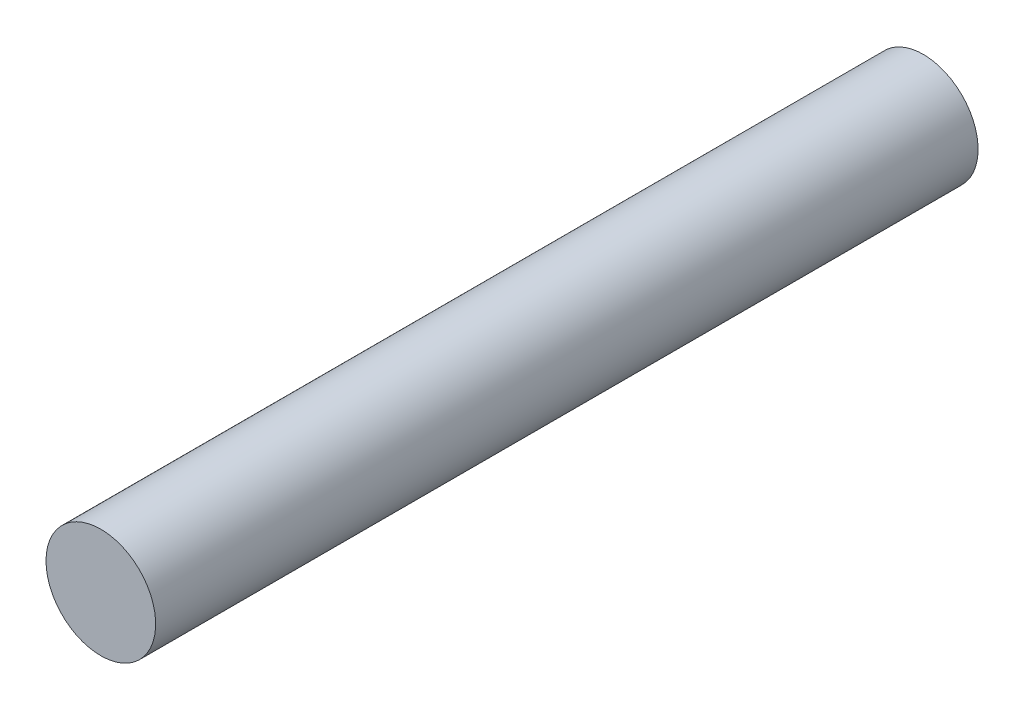
ISO-10303-21;
HEADER;
FILE_DESCRIPTION(('STEP AP214'),'2;1');
FILE_NAME('part.step','',(''),(''),'','','');
FILE_SCHEMA(('AUTOMOTIVE_DESIGN { 1 0 10303 214 1 1 1 1 }'));
ENDSEC;
DATA;
#1=APPLICATION_CONTEXT('core data for automotive mechanical design processes');
#2=APPLICATION_PROTOCOL_DEFINITION('international standard','automotive_design',2000,#1);
#3=PRODUCT_CONTEXT('',#1,'mechanical');
#4=PRODUCT('Part','Part','',(#3));
#5=PRODUCT_RELATED_PRODUCT_CATEGORY('part','',(#4));
#6=PRODUCT_DEFINITION_FORMATION('','',#4);
#7=PRODUCT_DEFINITION_CONTEXT('part definition',#1,'design');
#8=PRODUCT_DEFINITION('design','',#6,#7);
#9=PRODUCT_DEFINITION_SHAPE('','',#8);
#10=(LENGTH_UNIT() NAMED_UNIT(*) SI_UNIT(.MILLI.,.METRE.));
#11=(NAMED_UNIT(*) PLANE_ANGLE_UNIT() SI_UNIT($,.RADIAN.));
#12=(NAMED_UNIT(*) SI_UNIT($,.STERADIAN.) SOLID_ANGLE_UNIT());
#13=UNCERTAINTY_MEASURE_WITH_UNIT(LENGTH_MEASURE(1.E-05),#10,'distance_accuracy_value','');
#14=(GEOMETRIC_REPRESENTATION_CONTEXT(3) GLOBAL_UNCERTAINTY_ASSIGNED_CONTEXT((#13)) GLOBAL_UNIT_ASSIGNED_CONTEXT((#10,
#11,#12)) REPRESENTATION_CONTEXT('',''));
#15=CARTESIAN_POINT('',(0.,0.,0.));
#16=DIRECTION('',(0.,0.,1.));
#17=DIRECTION('',(1.,0.,0.));
#18=AXIS2_PLACEMENT_3D('',#15,#16,#17);
#19=CARTESIAN_POINT('',(0.,0.,45.));
#20=DIRECTION('',(0.,0.,-1.));
#21=DIRECTION('',(-1.,0.,0.));
#22=AXIS2_PLACEMENT_3D('',#19,#20,#21);
#23=CYLINDRICAL_SURFACE('',#22,3.);
#24=CARTESIAN_POINT('',(0.,0.,45.));
#25=DIRECTION('',(0.,0.,1.));
#26=DIRECTION('',(1.,0.,0.));
#27=AXIS2_PLACEMENT_3D('',#24,#25,#26);
#28=CIRCLE('',#27,3.);
#29=CARTESIAN_POINT('',(-3.,0.,45.));
#30=VERTEX_POINT('',#29);
#31=EDGE_CURVE('E10',#30,#30,#28,.T.);
#32=CARTESIAN_POINT('',(0.,0.,0.));
#33=DIRECTION('',(0.,0.,1.));
#34=DIRECTION('',(1.,0.,0.));
#35=AXIS2_PLACEMENT_3D('',#32,#33,#34);
#36=CIRCLE('',#35,3.);
#37=CARTESIAN_POINT('',(-3.,0.,0.));
#38=VERTEX_POINT('',#37);
#39=EDGE_CURVE('E40',#38,#38,#36,.T.);
#40=CARTESIAN_POINT('',(-3.,0.,45.));
#41=CARTESIAN_POINT('',(-3.,0.,44.53125));
#42=CARTESIAN_POINT('',(-3.,0.,44.0625));
#43=CARTESIAN_POINT('',(-3.,0.,43.125));
#44=CARTESIAN_POINT('',(-3.,0.,42.65625));
#45=CARTESIAN_POINT('',(-3.,0.,41.71875));
#46=CARTESIAN_POINT('',(-3.,0.,41.25));
#47=CARTESIAN_POINT('',(-3.,0.,40.3125));
#48=CARTESIAN_POINT('',(-3.,0.,39.84375));
#49=CARTESIAN_POINT('',(-3.,0.,38.90625));
#50=CARTESIAN_POINT('',(-3.,0.,38.4375));
#51=CARTESIAN_POINT('',(-3.,0.,37.5));
#52=CARTESIAN_POINT('',(-3.,0.,37.03125));
#53=CARTESIAN_POINT('',(-3.,0.,36.09375));
#54=CARTESIAN_POINT('',(-3.,0.,35.625));
#55=CARTESIAN_POINT('',(-3.,0.,34.6875));
#56=CARTESIAN_POINT('',(-3.,0.,34.21875));
#57=CARTESIAN_POINT('',(-3.,0.,33.28125));
#58=CARTESIAN_POINT('',(-3.,0.,32.8125));
#59=CARTESIAN_POINT('',(-3.,0.,31.875));
#60=CARTESIAN_POINT('',(-3.,0.,31.40625));
#61=CARTESIAN_POINT('',(-3.,0.,30.46875));
#62=CARTESIAN_POINT('',(-3.,0.,30.));
#63=CARTESIAN_POINT('',(-3.,0.,29.0625));
#64=CARTESIAN_POINT('',(-3.,0.,28.59375));
#65=CARTESIAN_POINT('',(-3.,0.,27.65625));
#66=CARTESIAN_POINT('',(-3.,0.,27.1875));
#67=CARTESIAN_POINT('',(-3.,0.,26.25));
#68=CARTESIAN_POINT('',(-3.,0.,25.78125));
#69=CARTESIAN_POINT('',(-3.,0.,24.84375));
#70=CARTESIAN_POINT('',(-3.,0.,24.375));
#71=CARTESIAN_POINT('',(-3.,0.,23.4375));
#72=CARTESIAN_POINT('',(-3.,0.,22.96875));
#73=CARTESIAN_POINT('',(-3.,0.,22.03125));
#74=CARTESIAN_POINT('',(-3.,0.,21.5625));
#75=CARTESIAN_POINT('',(-3.,0.,20.625));
#76=CARTESIAN_POINT('',(-3.,0.,20.15625));
#77=CARTESIAN_POINT('',(-3.,0.,19.21875));
#78=CARTESIAN_POINT('',(-3.,0.,18.75));
#79=CARTESIAN_POINT('',(-3.,0.,17.8125));
#80=CARTESIAN_POINT('',(-3.,0.,17.34375));
#81=CARTESIAN_POINT('',(-3.,0.,16.40625));
#82=CARTESIAN_POINT('',(-3.,0.,15.9375));
#83=CARTESIAN_POINT('',(-3.,0.,15.));
#84=CARTESIAN_POINT('',(-3.,0.,14.53125));
#85=CARTESIAN_POINT('',(-3.,0.,13.59375));
#86=CARTESIAN_POINT('',(-3.,0.,13.125));
#87=CARTESIAN_POINT('',(-3.,0.,12.1875));
#88=CARTESIAN_POINT('',(-3.,0.,11.71875));
#89=CARTESIAN_POINT('',(-3.,0.,10.78125));
#90=CARTESIAN_POINT('',(-3.,0.,10.3125));
#91=CARTESIAN_POINT('',(-3.,0.,9.375));
#92=CARTESIAN_POINT('',(-3.,0.,8.90625));
#93=CARTESIAN_POINT('',(-3.,0.,7.96874999999999));
#94=CARTESIAN_POINT('',(-3.,0.,7.5));
#95=CARTESIAN_POINT('',(-3.,0.,6.5625));
#96=CARTESIAN_POINT('',(-3.,0.,6.09375));
#97=CARTESIAN_POINT('',(-3.,0.,5.15625));
#98=CARTESIAN_POINT('',(-3.,0.,4.68749999999999));
#99=CARTESIAN_POINT('',(-3.,0.,3.74999999999999));
#100=CARTESIAN_POINT('',(-3.,0.,3.28124999999999));
#101=CARTESIAN_POINT('',(-3.,0.,2.34374999999999));
#102=CARTESIAN_POINT('',(-3.,0.,1.87499999999999));
#103=CARTESIAN_POINT('',(-3.,0.,0.937499999999992));
#104=CARTESIAN_POINT('',(-3.,0.,0.468749999999993));
#105=CARTESIAN_POINT('',(-3.,0.,0.));
#106=B_SPLINE_CURVE_WITH_KNOTS('',3,(#40,#41,#42,#43,#44,#45,#46,#47,#48,#49,#50,#51,#52,#53,
#54,#55,#56,#57,#58,#59,#60,#61,#62,#63,#64,#65,#66,#67,#68,#69,#70,#71,#72,#73,#74,#75,#76,#77,
#78,#79,#80,#81,#82,#83,#84,#85,#86,#87,#88,#89,#90,#91,#92,#93,#94,#95,#96,#97,#98,#99,#100,
#101,#102,#103,#104,#105),.UNSPECIFIED.,.F.,.F.,(4,2,2,2,2,2,2,2,2,2,2,2,2,2,2,2,2,2,2,2,2,2,2,
2,2,2,2,2,2,2,2,2,4),(0.,1.40625,2.8125,4.21875000000001,5.62500000000001,7.03125,8.4375,
9.84375000000001,11.25,12.65625,14.0625,15.46875,16.875,18.28125,19.6875,21.09375,22.5,23.90625,
25.3125,26.71875,28.125,29.53125,30.9375,32.34375,33.75,35.15625,36.5625,37.96875,39.375,
40.78125,42.1875,43.59375,45.),.UNSPECIFIED.);
#107=EDGE_CURVE('BSEAM37',#30,#38,#106,.T.);
#108=ORIENTED_EDGE('',*,*,#31,.F.);
#109=ORIENTED_EDGE('',*,*,#39,.T.);
#110=ORIENTED_EDGE('',*,*,#107,.T.);
#111=ORIENTED_EDGE('',*,*,#107,.F.);
#112=EDGE_LOOP('',(#108,#110,#109,#111));
#113=FACE_BOUND('',#112,.T.);
#114=ADVANCED_FACE('F37',(#113),#23,.T.);
#115=CARTESIAN_POINT('',(0.,0.,45.));
#116=DIRECTION('',(0.,0.,1.));
#117=DIRECTION('',(1.,0.,0.));
#118=AXIS2_PLACEMENT_3D('',#115,#116,#117);
#119=PLANE('',#118);
#120=ORIENTED_EDGE('',*,*,#31,.T.);
#121=EDGE_LOOP('',(#120));
#122=FACE_BOUND('',#121,.T.);
#123=ADVANCED_FACE('F52',(#122),#119,.T.);
#124=CARTESIAN_POINT('',(0.,0.,0.));
#125=DIRECTION('',(0.,0.,1.));
#126=DIRECTION('',(1.,0.,0.));
#127=AXIS2_PLACEMENT_3D('',#124,#125,#126);
#128=PLANE('',#127);
#129=ORIENTED_EDGE('',*,*,#39,.F.);
#130=EDGE_LOOP('',(#129));
#131=FACE_BOUND('',#130,.T.);
#132=ADVANCED_FACE('F50',(#131),#128,.F.);
#133=CLOSED_SHELL('',(#114,#123,#132));
#134=MANIFOLD_SOLID_BREP('B2',#133);
#135=ADVANCED_BREP_SHAPE_REPRESENTATION('',(#18,#134),#14);
#136=SHAPE_DEFINITION_REPRESENTATION(#9,#135);
ENDSEC;
END-ISO-10303-21;
